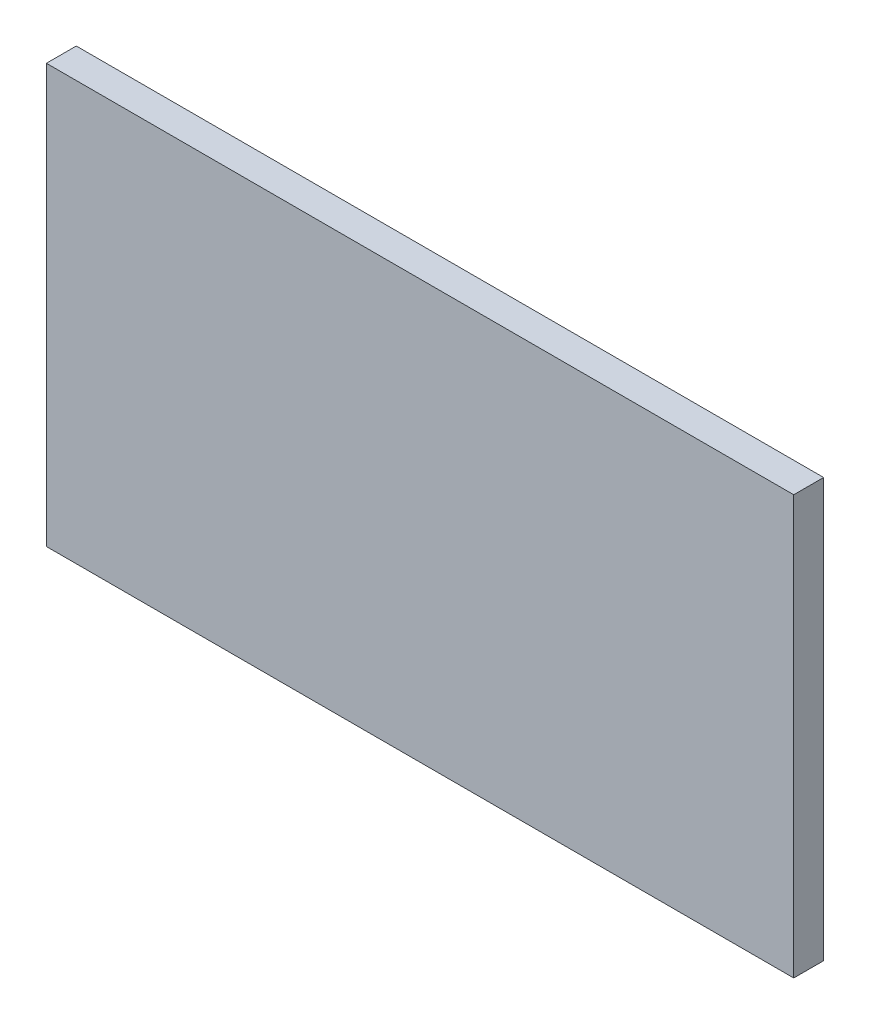
ISO-10303-21;
HEADER;
FILE_DESCRIPTION(('STEP AP214'),'2;1');
FILE_NAME('part.step','',(''),(''),'','','');
FILE_SCHEMA(('AUTOMOTIVE_DESIGN { 1 0 10303 214 1 1 1 1 }'));
ENDSEC;
DATA;
#1=APPLICATION_CONTEXT('core data for automotive mechanical design processes');
#2=APPLICATION_PROTOCOL_DEFINITION('international standard','automotive_design',2000,#1);
#3=PRODUCT_CONTEXT('',#1,'mechanical');
#4=PRODUCT('Part','Part','',(#3));
#5=PRODUCT_RELATED_PRODUCT_CATEGORY('part','',(#4));
#6=PRODUCT_DEFINITION_FORMATION('','',#4);
#7=PRODUCT_DEFINITION_CONTEXT('part definition',#1,'design');
#8=PRODUCT_DEFINITION('design','',#6,#7);
#9=PRODUCT_DEFINITION_SHAPE('','',#8);
#10=(LENGTH_UNIT() NAMED_UNIT(*) SI_UNIT(.MILLI.,.METRE.));
#11=(NAMED_UNIT(*) PLANE_ANGLE_UNIT() SI_UNIT($,.RADIAN.));
#12=(NAMED_UNIT(*) SI_UNIT($,.STERADIAN.) SOLID_ANGLE_UNIT());
#13=UNCERTAINTY_MEASURE_WITH_UNIT(LENGTH_MEASURE(1.E-05),#10,'distance_accuracy_value','');
#14=(GEOMETRIC_REPRESENTATION_CONTEXT(3) GLOBAL_UNCERTAINTY_ASSIGNED_CONTEXT((#13)) GLOBAL_UNIT_ASSIGNED_CONTEXT((#10,
#11,#12)) REPRESENTATION_CONTEXT('',''));
#15=CARTESIAN_POINT('',(0.,0.,0.));
#16=DIRECTION('',(0.,0.,1.));
#17=DIRECTION('',(1.,0.,0.));
#18=AXIS2_PLACEMENT_3D('',#15,#16,#17);
#19=CARTESIAN_POINT('',(-158.75,-88.9,12.7));
#20=DIRECTION('',(1.,0.,0.));
#21=DIRECTION('',(0.,0.,-1.));
#22=AXIS2_PLACEMENT_3D('',#19,#20,#21);
#23=PLANE('',#22);
#24=DIRECTION('',(0.,-1.,0.));
#25=VECTOR('',#24,1.);
#26=CARTESIAN_POINT('',(-158.75,-88.9,0.));
#27=LINE('',#26,#25);
#28=CARTESIAN_POINT('',(-158.75,88.9,0.));
#29=VERTEX_POINT('',#28);
#30=CARTESIAN_POINT('',(-158.75,-88.9,0.));
#31=VERTEX_POINT('',#30);
#32=EDGE_CURVE('E107',#29,#31,#27,.T.);
#33=ORIENTED_EDGE('',*,*,#32,.T.);
#34=DIRECTION('',(0.,0.,-1.));
#35=VECTOR('',#34,1.);
#36=CARTESIAN_POINT('',(-158.75,-88.9,12.7));
#37=LINE('',#36,#35);
#38=CARTESIAN_POINT('',(-158.75,-88.9,12.7));
#39=VERTEX_POINT('',#38);
#40=EDGE_CURVE('E11',#39,#31,#37,.T.);
#41=ORIENTED_EDGE('',*,*,#40,.F.);
#42=DIRECTION('',(0.,-1.,0.));
#43=VECTOR('',#42,1.);
#44=CARTESIAN_POINT('',(-158.75,-88.9,12.7));
#45=LINE('',#44,#43);
#46=CARTESIAN_POINT('',(-158.75,88.9,12.7));
#47=VERTEX_POINT('',#46);
#48=EDGE_CURVE('E95',#47,#39,#45,.T.);
#49=ORIENTED_EDGE('',*,*,#48,.F.);
#50=DIRECTION('',(0.,0.,-1.));
#51=VECTOR('',#50,1.);
#52=CARTESIAN_POINT('',(-158.75,88.9,12.7));
#53=LINE('',#52,#51);
#54=EDGE_CURVE('E103',#47,#29,#53,.T.);
#55=ORIENTED_EDGE('',*,*,#54,.T.);
#56=EDGE_LOOP('',(#33,#41,#49,#55));
#57=FACE_BOUND('',#56,.T.);
#58=ADVANCED_FACE('F44',(#57),#23,.F.);
#59=CARTESIAN_POINT('',(158.75,-88.8999999999999,12.7));
#60=DIRECTION('',(0.,1.,0.));
#61=DIRECTION('',(-1.,0.,0.));
#62=AXIS2_PLACEMENT_3D('',#59,#60,#61);
#63=PLANE('',#62);
#64=DIRECTION('',(1.,0.,0.));
#65=VECTOR('',#64,1.);
#66=CARTESIAN_POINT('',(158.75,-88.8999999999999,0.));
#67=LINE('',#66,#65);
#68=CARTESIAN_POINT('',(158.75,-88.8999999999999,0.));
#69=VERTEX_POINT('',#68);
#70=EDGE_CURVE('E99',#31,#69,#67,.T.);
#71=ORIENTED_EDGE('',*,*,#70,.T.);
#72=DIRECTION('',(0.,0.,-1.));
#73=VECTOR('',#72,1.);
#74=CARTESIAN_POINT('',(158.75,-88.8999999999999,12.7));
#75=LINE('',#74,#73);
#76=CARTESIAN_POINT('',(158.75,-88.8999999999999,12.7));
#77=VERTEX_POINT('',#76);
#78=EDGE_CURVE('E52',#77,#69,#75,.T.);
#79=ORIENTED_EDGE('',*,*,#78,.F.);
#80=DIRECTION('',(1.,0.,0.));
#81=VECTOR('',#80,1.);
#82=CARTESIAN_POINT('',(158.75,-88.8999999999999,12.7));
#83=LINE('',#82,#81);
#84=EDGE_CURVE('E90',#39,#77,#83,.T.);
#85=ORIENTED_EDGE('',*,*,#84,.F.);
#86=ORIENTED_EDGE('',*,*,#40,.T.);
#87=EDGE_LOOP('',(#71,#79,#85,#86));
#88=FACE_BOUND('',#87,.T.);
#89=ADVANCED_FACE('F98',(#88),#63,.F.);
#90=CARTESIAN_POINT('',(158.75,-88.8999999999999,12.7));
#91=DIRECTION('',(-1.,0.,0.));
#92=DIRECTION('',(0.,0.,1.));
#93=AXIS2_PLACEMENT_3D('',#90,#91,#92);
#94=PLANE('',#93);
#95=DIRECTION('',(0.,1.,0.));
#96=VECTOR('',#95,1.);
#97=CARTESIAN_POINT('',(158.75,-88.8999999999999,0.));
#98=LINE('',#97,#96);
#99=CARTESIAN_POINT('',(158.75,88.9,0.));
#100=VERTEX_POINT('',#99);
#101=EDGE_CURVE('E77',#69,#100,#98,.T.);
#102=ORIENTED_EDGE('',*,*,#101,.T.);
#103=DIRECTION('',(0.,0.,-1.));
#104=VECTOR('',#103,1.);
#105=CARTESIAN_POINT('',(158.75,88.9,12.7));
#106=LINE('',#105,#104);
#107=CARTESIAN_POINT('',(158.75,88.9,12.7));
#108=VERTEX_POINT('',#107);
#109=EDGE_CURVE('E100',#108,#100,#106,.T.);
#110=ORIENTED_EDGE('',*,*,#109,.F.);
#111=DIRECTION('',(0.,1.,0.));
#112=VECTOR('',#111,1.);
#113=CARTESIAN_POINT('',(158.75,-88.8999999999999,12.7));
#114=LINE('',#113,#112);
#115=EDGE_CURVE('E93',#77,#108,#114,.T.);
#116=ORIENTED_EDGE('',*,*,#115,.F.);
#117=ORIENTED_EDGE('',*,*,#78,.T.);
#118=EDGE_LOOP('',(#102,#110,#116,#117));
#119=FACE_BOUND('',#118,.T.);
#120=ADVANCED_FACE('F101',(#119),#94,.F.);
#121=CARTESIAN_POINT('',(158.75,88.9,12.7));
#122=DIRECTION('',(0.,-1.,0.));
#123=DIRECTION('',(1.,0.,0.));
#124=AXIS2_PLACEMENT_3D('',#121,#122,#123);
#125=PLANE('',#124);
#126=DIRECTION('',(-1.,0.,0.));
#127=VECTOR('',#126,1.);
#128=CARTESIAN_POINT('',(158.75,88.9,0.));
#129=LINE('',#128,#127);
#130=EDGE_CURVE('E83',#100,#29,#129,.T.);
#131=ORIENTED_EDGE('',*,*,#130,.T.);
#132=ORIENTED_EDGE('',*,*,#54,.F.);
#133=DIRECTION('',(-1.,0.,0.));
#134=VECTOR('',#133,1.);
#135=CARTESIAN_POINT('',(158.75,88.9,12.7));
#136=LINE('',#135,#134);
#137=EDGE_CURVE('E60',#108,#47,#136,.T.);
#138=ORIENTED_EDGE('',*,*,#137,.F.);
#139=ORIENTED_EDGE('',*,*,#109,.T.);
#140=EDGE_LOOP('',(#131,#132,#138,#139));
#141=FACE_BOUND('',#140,.T.);
#142=ADVANCED_FACE('F114',(#141),#125,.F.);
#143=CARTESIAN_POINT('',(0.,0.,12.7));
#144=DIRECTION('',(0.,0.,1.));
#145=DIRECTION('',(1.,0.,0.));
#146=AXIS2_PLACEMENT_3D('',#143,#144,#145);
#147=PLANE('',#146);
#148=ORIENTED_EDGE('',*,*,#48,.T.);
#149=ORIENTED_EDGE('',*,*,#84,.T.);
#150=ORIENTED_EDGE('',*,*,#115,.T.);
#151=ORIENTED_EDGE('',*,*,#137,.T.);
#152=EDGE_LOOP('',(#148,#149,#150,#151));
#153=FACE_BOUND('',#152,.T.);
#154=ADVANCED_FACE('F91',(#153),#147,.T.);
#155=CARTESIAN_POINT('',(0.,0.,0.));
#156=DIRECTION('',(0.,0.,1.));
#157=DIRECTION('',(1.,0.,0.));
#158=AXIS2_PLACEMENT_3D('',#155,#156,#157);
#159=PLANE('',#158);
#160=ORIENTED_EDGE('',*,*,#32,.F.);
#161=ORIENTED_EDGE('',*,*,#130,.F.);
#162=ORIENTED_EDGE('',*,*,#101,.F.);
#163=ORIENTED_EDGE('',*,*,#70,.F.);
#164=EDGE_LOOP('',(#160,#161,#162,#163));
#165=FACE_BOUND('',#164,.T.);
#166=ADVANCED_FACE('F117',(#165),#159,.F.);
#167=CLOSED_SHELL('',(#58,#89,#120,#142,#154,#166));
#168=MANIFOLD_SOLID_BREP('B2',#167);
#169=ADVANCED_BREP_SHAPE_REPRESENTATION('',(#18,#168),#14);
#170=SHAPE_DEFINITION_REPRESENTATION(#9,#169);
ENDSEC;
END-ISO-10303-21;
